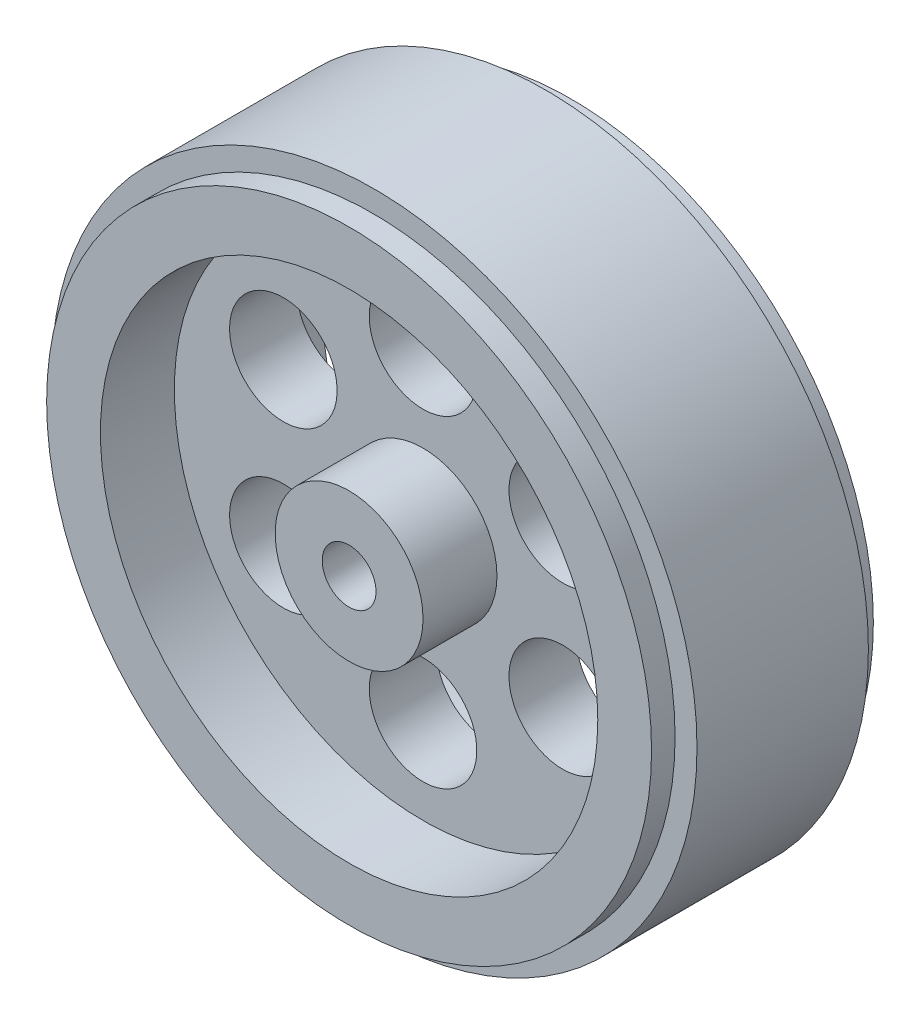
ISO-10303-21;
HEADER;
FILE_DESCRIPTION(('STEP AP214'),'2;1');
FILE_NAME('part.step','',(''),(''),'','','');
FILE_SCHEMA(('AUTOMOTIVE_DESIGN { 1 0 10303 214 1 1 1 1 }'));
ENDSEC;
DATA;
#1=APPLICATION_CONTEXT('core data for automotive mechanical design processes');
#2=APPLICATION_PROTOCOL_DEFINITION('international standard','automotive_design',2000,#1);
#3=PRODUCT_CONTEXT('',#1,'mechanical');
#4=PRODUCT('Part','Part','',(#3));
#5=PRODUCT_RELATED_PRODUCT_CATEGORY('part','',(#4));
#6=PRODUCT_DEFINITION_FORMATION('','',#4);
#7=PRODUCT_DEFINITION_CONTEXT('part definition',#1,'design');
#8=PRODUCT_DEFINITION('design','',#6,#7);
#9=PRODUCT_DEFINITION_SHAPE('','',#8);
#10=(LENGTH_UNIT() NAMED_UNIT(*) SI_UNIT(.MILLI.,.METRE.));
#11=(NAMED_UNIT(*) PLANE_ANGLE_UNIT() SI_UNIT($,.RADIAN.));
#12=(NAMED_UNIT(*) SI_UNIT($,.STERADIAN.) SOLID_ANGLE_UNIT());
#13=UNCERTAINTY_MEASURE_WITH_UNIT(LENGTH_MEASURE(1.E-05),#10,'distance_accuracy_value','');
#14=(GEOMETRIC_REPRESENTATION_CONTEXT(3) GLOBAL_UNCERTAINTY_ASSIGNED_CONTEXT((#13)) GLOBAL_UNIT_ASSIGNED_CONTEXT((#10,
#11,#12)) REPRESENTATION_CONTEXT('',''));
#15=CARTESIAN_POINT('',(0.,0.,0.));
#16=DIRECTION('',(0.,0.,1.));
#17=DIRECTION('',(1.,0.,0.));
#18=AXIS2_PLACEMENT_3D('',#15,#16,#17);
#19=CARTESIAN_POINT('',(0.,42.,13.));
#20=DIRECTION('',(0.,0.,1.));
#21=DIRECTION('',(1.,0.,0.));
#22=AXIS2_PLACEMENT_3D('',#19,#20,#21);
#23=PLANE('',#22);
#24=CARTESIAN_POINT('',(0.,0.,13.));
#25=DIRECTION('',(0.,0.,1.));
#26=DIRECTION('',(1.,0.,0.));
#27=AXIS2_PLACEMENT_3D('',#24,#25,#26);
#28=CIRCLE('',#27,45.);
#29=CARTESIAN_POINT('',(45.,0.,13.));
#30=VERTEX_POINT('',#29);
#31=EDGE_CURVE('E11',#30,#30,#28,.T.);
#32=ORIENTED_EDGE('',*,*,#31,.F.);
#33=EDGE_LOOP('',(#32));
#34=FACE_BOUND('',#33,.T.);
#35=CARTESIAN_POINT('',(0.,0.,13.));
#36=DIRECTION('',(0.,0.,1.));
#37=DIRECTION('',(1.,0.,0.));
#38=AXIS2_PLACEMENT_3D('',#35,#36,#37);
#39=CIRCLE('',#38,42.);
#40=CARTESIAN_POINT('',(42.,0.,13.));
#41=VERTEX_POINT('',#40);
#42=EDGE_CURVE('E87',#41,#41,#39,.T.);
#43=ORIENTED_EDGE('',*,*,#42,.T.);
#44=EDGE_LOOP('',(#43));
#45=FACE_BOUND('',#44,.T.);
#46=ADVANCED_FACE('F41',(#34,#45),#23,.F.);
#47=CARTESIAN_POINT('',(0.,0.,177.272954682522));
#48=DIRECTION('',(0.,0.,1.));
#49=DIRECTION('',(1.,0.,0.));
#50=AXIS2_PLACEMENT_3D('',#47,#48,#49);
#51=CYLINDRICAL_SURFACE('',#50,45.);
#52=CARTESIAN_POINT('',(0.,0.,16.5));
#53=DIRECTION('',(0.,0.,1.));
#54=DIRECTION('',(1.,0.,0.));
#55=AXIS2_PLACEMENT_3D('',#52,#53,#54);
#56=CIRCLE('',#55,45.);
#57=CARTESIAN_POINT('',(45.,0.,16.5));
#58=VERTEX_POINT('',#57);
#59=EDGE_CURVE('E47',#58,#58,#56,.T.);
#60=ORIENTED_EDGE('',*,*,#59,.F.);
#61=EDGE_LOOP('',(#60));
#62=FACE_BOUND('',#61,.T.);
#63=ORIENTED_EDGE('',*,*,#31,.T.);
#64=EDGE_LOOP('',(#63));
#65=FACE_BOUND('',#64,.T.);
#66=ADVANCED_FACE('F175',(#62,#65),#51,.T.);
#67=CARTESIAN_POINT('',(0.,45.,16.5));
#68=DIRECTION('',(0.,0.,-1.));
#69=DIRECTION('',(-1.,0.,0.));
#70=AXIS2_PLACEMENT_3D('',#67,#68,#69);
#71=PLANE('',#70);
#72=CARTESIAN_POINT('',(0.,0.,16.5));
#73=DIRECTION('',(0.,0.,1.));
#74=DIRECTION('',(1.,0.,0.));
#75=AXIS2_PLACEMENT_3D('',#72,#73,#74);
#76=CIRCLE('',#75,37.);
#77=CARTESIAN_POINT('',(37.,0.,16.5));
#78=VERTEX_POINT('',#77);
#79=EDGE_CURVE('E51',#78,#78,#76,.T.);
#80=ORIENTED_EDGE('',*,*,#79,.F.);
#81=EDGE_LOOP('',(#80));
#82=FACE_BOUND('',#81,.T.);
#83=ORIENTED_EDGE('',*,*,#59,.T.);
#84=EDGE_LOOP('',(#83));
#85=FACE_BOUND('',#84,.T.);
#86=ADVANCED_FACE('F170',(#82,#85),#71,.F.);
#87=CARTESIAN_POINT('',(0.,0.,177.272954682522));
#88=DIRECTION('',(0.,0.,1.));
#89=DIRECTION('',(1.,0.,0.));
#90=AXIS2_PLACEMENT_3D('',#87,#88,#89);
#91=CYLINDRICAL_SURFACE('',#90,37.);
#92=CARTESIAN_POINT('',(0.,0.,5.50000000000001));
#93=DIRECTION('',(0.,0.,1.));
#94=DIRECTION('',(1.,0.,0.));
#95=AXIS2_PLACEMENT_3D('',#92,#93,#94);
#96=CIRCLE('',#95,37.);
#97=CARTESIAN_POINT('',(37.,0.,5.50000000000001));
#98=VERTEX_POINT('',#97);
#99=EDGE_CURVE('E55',#98,#98,#96,.T.);
#100=ORIENTED_EDGE('',*,*,#99,.F.);
#101=EDGE_LOOP('',(#100));
#102=FACE_BOUND('',#101,.T.);
#103=ORIENTED_EDGE('',*,*,#79,.T.);
#104=EDGE_LOOP('',(#103));
#105=FACE_BOUND('',#104,.T.);
#106=ADVANCED_FACE('F163',(#102,#105),#91,.F.);
#107=CARTESIAN_POINT('',(0.,11.,5.5));
#108=DIRECTION('',(0.,0.,-1.));
#109=DIRECTION('',(-1.,0.,0.));
#110=AXIS2_PLACEMENT_3D('',#107,#108,#109);
#111=PLANE('',#110);
#112=CARTESIAN_POINT('',(-20.7846096908273,12.0000000000012,5.49999999999999));
#113=DIRECTION('',(0.,0.,-1.));
#114=DIRECTION('',(-1.,0.,0.));
#115=AXIS2_PLACEMENT_3D('',#112,#113,#114);
#116=CIRCLE('',#115,8.);
#117=CARTESIAN_POINT('',(-28.7846096908273,12.0000000000012,5.49999999999999));
#118=VERTEX_POINT('',#117);
#119=EDGE_CURVE('E90',#118,#118,#116,.T.);
#120=ORIENTED_EDGE('',*,*,#119,.T.);
#121=EDGE_LOOP('',(#120));
#122=FACE_BOUND('',#121,.T.);
#123=CARTESIAN_POINT('',(-20.7846096908286,-11.9999999999988,5.49999999999999));
#124=DIRECTION('',(0.,0.,-1.));
#125=DIRECTION('',(-1.,0.,0.));
#126=AXIS2_PLACEMENT_3D('',#123,#124,#125);
#127=CIRCLE('',#126,8.);
#128=CARTESIAN_POINT('',(-28.7846096908286,-11.9999999999988,5.49999999999999));
#129=VERTEX_POINT('',#128);
#130=EDGE_CURVE('E93',#129,#129,#127,.T.);
#131=ORIENTED_EDGE('',*,*,#130,.T.);
#132=EDGE_LOOP('',(#131));
#133=FACE_BOUND('',#132,.T.);
#134=CARTESIAN_POINT('',(-2.77926552252381E-12,-24.,5.49999999999999));
#135=DIRECTION('',(0.,0.,-1.));
#136=DIRECTION('',(-1.,0.,0.));
#137=AXIS2_PLACEMENT_3D('',#134,#135,#136);
#138=CIRCLE('',#137,8.);
#139=CARTESIAN_POINT('',(-8.00000000000278,-24.,5.49999999999999));
#140=VERTEX_POINT('',#139);
#141=EDGE_CURVE('E96',#140,#140,#138,.T.);
#142=ORIENTED_EDGE('',*,*,#141,.T.);
#143=EDGE_LOOP('',(#142));
#144=FACE_BOUND('',#143,.T.);
#145=CARTESIAN_POINT('',(20.7846096908244,-12.0000000000012,5.49999999999999));
#146=DIRECTION('',(0.,0.,-1.));
#147=DIRECTION('',(-1.,0.,0.));
#148=AXIS2_PLACEMENT_3D('',#145,#146,#147);
#149=CIRCLE('',#148,8.);
#150=CARTESIAN_POINT('',(12.7846096908244,-12.0000000000012,5.49999999999999));
#151=VERTEX_POINT('',#150);
#152=EDGE_CURVE('E99',#151,#151,#149,.T.);
#153=ORIENTED_EDGE('',*,*,#152,.T.);
#154=EDGE_LOOP('',(#153));
#155=FACE_BOUND('',#154,.T.);
#156=CARTESIAN_POINT('',(20.7846096908258,11.9999999999988,5.49999999999999));
#157=DIRECTION('',(0.,0.,-1.));
#158=DIRECTION('',(-1.,0.,0.));
#159=AXIS2_PLACEMENT_3D('',#156,#157,#158);
#160=CIRCLE('',#159,8.);
#161=CARTESIAN_POINT('',(12.7846096908258,11.9999999999988,5.49999999999999));
#162=VERTEX_POINT('',#161);
#163=EDGE_CURVE('E102',#162,#162,#160,.T.);
#164=ORIENTED_EDGE('',*,*,#163,.T.);
#165=EDGE_LOOP('',(#164));
#166=FACE_BOUND('',#165,.T.);
#167=CARTESIAN_POINT('',(0.,24.,5.49999999999999));
#168=DIRECTION('',(0.,0.,-1.));
#169=DIRECTION('',(-1.,0.,0.));
#170=AXIS2_PLACEMENT_3D('',#167,#168,#169);
#171=CIRCLE('',#170,8.);
#172=CARTESIAN_POINT('',(-8.00000000000006,24.,5.49999999999999));
#173=VERTEX_POINT('',#172);
#174=EDGE_CURVE('E105',#173,#173,#171,.T.);
#175=ORIENTED_EDGE('',*,*,#174,.T.);
#176=EDGE_LOOP('',(#175));
#177=FACE_BOUND('',#176,.T.);
#178=CARTESIAN_POINT('',(0.,0.,5.50000000000001));
#179=DIRECTION('',(0.,0.,1.));
#180=DIRECTION('',(1.,0.,0.));
#181=AXIS2_PLACEMENT_3D('',#178,#179,#180);
#182=CIRCLE('',#181,11.);
#183=CARTESIAN_POINT('',(11.,0.,5.50000000000001));
#184=VERTEX_POINT('',#183);
#185=EDGE_CURVE('E60',#184,#184,#182,.T.);
#186=ORIENTED_EDGE('',*,*,#185,.F.);
#187=EDGE_LOOP('',(#186));
#188=FACE_BOUND('',#187,.T.);
#189=ORIENTED_EDGE('',*,*,#99,.T.);
#190=EDGE_LOOP('',(#189));
#191=FACE_BOUND('',#190,.T.);
#192=ADVANCED_FACE('F157',(#122,#133,#144,#155,#166,#177,#188,#191),#111,.F.);
#193=CARTESIAN_POINT('',(0.,0.,177.272954682522));
#194=DIRECTION('',(0.,0.,1.));
#195=DIRECTION('',(1.,0.,0.));
#196=AXIS2_PLACEMENT_3D('',#193,#194,#195);
#197=CYLINDRICAL_SURFACE('',#196,11.);
#198=CARTESIAN_POINT('',(0.,0.,16.5));
#199=DIRECTION('',(0.,0.,1.));
#200=DIRECTION('',(1.,0.,0.));
#201=AXIS2_PLACEMENT_3D('',#198,#199,#200);
#202=CIRCLE('',#201,11.);
#203=CARTESIAN_POINT('',(11.,0.,16.5));
#204=VERTEX_POINT('',#203);
#205=EDGE_CURVE('E63',#204,#204,#202,.T.);
#206=ORIENTED_EDGE('',*,*,#205,.F.);
#207=EDGE_LOOP('',(#206));
#208=FACE_BOUND('',#207,.T.);
#209=ORIENTED_EDGE('',*,*,#185,.T.);
#210=EDGE_LOOP('',(#209));
#211=FACE_BOUND('',#210,.T.);
#212=ADVANCED_FACE('F151',(#208,#211),#197,.T.);
#213=CARTESIAN_POINT('',(0.,4.,16.5));
#214=DIRECTION('',(0.,0.,-1.));
#215=DIRECTION('',(-1.,0.,0.));
#216=AXIS2_PLACEMENT_3D('',#213,#214,#215);
#217=PLANE('',#216);
#218=CARTESIAN_POINT('',(0.,0.,16.5));
#219=DIRECTION('',(0.,0.,1.));
#220=DIRECTION('',(1.,0.,0.));
#221=AXIS2_PLACEMENT_3D('',#218,#219,#220);
#222=CIRCLE('',#221,4.);
#223=CARTESIAN_POINT('',(4.,0.,16.5));
#224=VERTEX_POINT('',#223);
#225=EDGE_CURVE('E66',#224,#224,#222,.T.);
#226=ORIENTED_EDGE('',*,*,#225,.F.);
#227=EDGE_LOOP('',(#226));
#228=FACE_BOUND('',#227,.T.);
#229=ORIENTED_EDGE('',*,*,#205,.T.);
#230=EDGE_LOOP('',(#229));
#231=FACE_BOUND('',#230,.T.);
#232=ADVANCED_FACE('F145',(#228,#231),#217,.F.);
#233=CARTESIAN_POINT('',(0.,0.,177.272954682522));
#234=DIRECTION('',(0.,0.,1.));
#235=DIRECTION('',(1.,0.,0.));
#236=AXIS2_PLACEMENT_3D('',#233,#234,#235);
#237=CYLINDRICAL_SURFACE('',#236,4.);
#238=CARTESIAN_POINT('',(0.,0.,-4.5));
#239=DIRECTION('',(0.,0.,1.));
#240=DIRECTION('',(1.,0.,0.));
#241=AXIS2_PLACEMENT_3D('',#238,#239,#240);
#242=CIRCLE('',#241,4.);
#243=CARTESIAN_POINT('',(4.,0.,-4.5));
#244=VERTEX_POINT('',#243);
#245=EDGE_CURVE('E69',#244,#244,#242,.T.);
#246=ORIENTED_EDGE('',*,*,#245,.F.);
#247=EDGE_LOOP('',(#246));
#248=FACE_BOUND('',#247,.T.);
#249=ORIENTED_EDGE('',*,*,#225,.T.);
#250=EDGE_LOOP('',(#249));
#251=FACE_BOUND('',#250,.T.);
#252=ADVANCED_FACE('F134',(#248,#251),#237,.F.);
#253=CARTESIAN_POINT('',(0.,37.,-4.5));
#254=DIRECTION('',(0.,0.,1.));
#255=DIRECTION('',(1.,0.,0.));
#256=AXIS2_PLACEMENT_3D('',#253,#254,#255);
#257=PLANE('',#256);
#258=CARTESIAN_POINT('',(-20.7846096908273,12.0000000000012,-4.5));
#259=DIRECTION('',(0.,0.,-1.));
#260=DIRECTION('',(-1.,0.,0.));
#261=AXIS2_PLACEMENT_3D('',#258,#259,#260);
#262=CIRCLE('',#261,8.);
#263=CARTESIAN_POINT('',(-28.7846096908273,12.0000000000012,-4.5));
#264=VERTEX_POINT('',#263);
#265=EDGE_CURVE('E111',#264,#264,#262,.T.);
#266=ORIENTED_EDGE('',*,*,#265,.F.);
#267=EDGE_LOOP('',(#266));
#268=FACE_BOUND('',#267,.T.);
#269=CARTESIAN_POINT('',(-20.7846096908286,-11.9999999999988,-4.5));
#270=DIRECTION('',(0.,0.,-1.));
#271=DIRECTION('',(-1.,0.,0.));
#272=AXIS2_PLACEMENT_3D('',#269,#270,#271);
#273=CIRCLE('',#272,8.);
#274=CARTESIAN_POINT('',(-28.7846096908286,-11.9999999999988,-4.5));
#275=VERTEX_POINT('',#274);
#276=EDGE_CURVE('E119',#275,#275,#273,.T.);
#277=ORIENTED_EDGE('',*,*,#276,.F.);
#278=EDGE_LOOP('',(#277));
#279=FACE_BOUND('',#278,.T.);
#280=CARTESIAN_POINT('',(-2.77926552252381E-12,-24.,-4.5));
#281=DIRECTION('',(0.,0.,-1.));
#282=DIRECTION('',(-1.,0.,0.));
#283=AXIS2_PLACEMENT_3D('',#280,#281,#282);
#284=CIRCLE('',#283,8.);
#285=CARTESIAN_POINT('',(-8.00000000000278,-24.,-4.5));
#286=VERTEX_POINT('',#285);
#287=EDGE_CURVE('E115',#286,#286,#284,.T.);
#288=ORIENTED_EDGE('',*,*,#287,.F.);
#289=EDGE_LOOP('',(#288));
#290=FACE_BOUND('',#289,.T.);
#291=CARTESIAN_POINT('',(20.7846096908244,-12.0000000000012,-4.5));
#292=DIRECTION('',(0.,0.,-1.));
#293=DIRECTION('',(-1.,0.,0.));
#294=AXIS2_PLACEMENT_3D('',#291,#292,#293);
#295=CIRCLE('',#294,8.);
#296=CARTESIAN_POINT('',(12.7846096908244,-12.0000000000012,-4.5));
#297=VERTEX_POINT('',#296);
#298=EDGE_CURVE('E112',#297,#297,#295,.T.);
#299=ORIENTED_EDGE('',*,*,#298,.F.);
#300=EDGE_LOOP('',(#299));
#301=FACE_BOUND('',#300,.T.);
#302=CARTESIAN_POINT('',(20.7846096908258,11.9999999999988,-4.5));
#303=DIRECTION('',(0.,0.,-1.));
#304=DIRECTION('',(-1.,0.,0.));
#305=AXIS2_PLACEMENT_3D('',#302,#303,#304);
#306=CIRCLE('',#305,8.);
#307=CARTESIAN_POINT('',(12.7846096908258,11.9999999999988,-4.5));
#308=VERTEX_POINT('',#307);
#309=EDGE_CURVE('E116',#308,#308,#306,.T.);
#310=ORIENTED_EDGE('',*,*,#309,.F.);
#311=EDGE_LOOP('',(#310));
#312=FACE_BOUND('',#311,.T.);
#313=CARTESIAN_POINT('',(0.,24.,-4.5));
#314=DIRECTION('',(0.,0.,-1.));
#315=DIRECTION('',(-1.,0.,0.));
#316=AXIS2_PLACEMENT_3D('',#313,#314,#315);
#317=CIRCLE('',#316,8.);
#318=CARTESIAN_POINT('',(-8.00000000000006,24.,-4.5));
#319=VERTEX_POINT('',#318);
#320=EDGE_CURVE('E108',#319,#319,#317,.T.);
#321=ORIENTED_EDGE('',*,*,#320,.F.);
#322=EDGE_LOOP('',(#321));
#323=FACE_BOUND('',#322,.T.);
#324=CARTESIAN_POINT('',(0.,0.,-4.5));
#325=DIRECTION('',(0.,0.,1.));
#326=DIRECTION('',(1.,0.,0.));
#327=AXIS2_PLACEMENT_3D('',#324,#325,#326);
#328=CIRCLE('',#327,37.);
#329=CARTESIAN_POINT('',(37.,0.,-4.5));
#330=VERTEX_POINT('',#329);
#331=EDGE_CURVE('E72',#330,#330,#328,.T.);
#332=ORIENTED_EDGE('',*,*,#331,.F.);
#333=EDGE_LOOP('',(#332));
#334=FACE_BOUND('',#333,.T.);
#335=ORIENTED_EDGE('',*,*,#245,.T.);
#336=EDGE_LOOP('',(#335));
#337=FACE_BOUND('',#336,.T.);
#338=ADVANCED_FACE('F130',(#268,#279,#290,#301,#312,#323,#334,#337),#257,.F.);
#339=CARTESIAN_POINT('',(0.,0.,177.272954682522));
#340=DIRECTION('',(0.,0.,1.));
#341=DIRECTION('',(1.,0.,0.));
#342=AXIS2_PLACEMENT_3D('',#339,#340,#341);
#343=CYLINDRICAL_SURFACE('',#342,37.);
#344=CARTESIAN_POINT('',(0.,0.,-16.5));
#345=DIRECTION('',(0.,0.,1.));
#346=DIRECTION('',(1.,0.,0.));
#347=AXIS2_PLACEMENT_3D('',#344,#345,#346);
#348=CIRCLE('',#347,37.);
#349=CARTESIAN_POINT('',(37.,0.,-16.5));
#350=VERTEX_POINT('',#349);
#351=EDGE_CURVE('E75',#350,#350,#348,.T.);
#352=ORIENTED_EDGE('',*,*,#351,.F.);
#353=EDGE_LOOP('',(#352));
#354=FACE_BOUND('',#353,.T.);
#355=ORIENTED_EDGE('',*,*,#331,.T.);
#356=EDGE_LOOP('',(#355));
#357=FACE_BOUND('',#356,.T.);
#358=ADVANCED_FACE('F133',(#354,#357),#343,.F.);
#359=CARTESIAN_POINT('',(0.,45.,-16.5));
#360=DIRECTION('',(0.,0.,1.));
#361=DIRECTION('',(1.,0.,0.));
#362=AXIS2_PLACEMENT_3D('',#359,#360,#361);
#363=PLANE('',#362);
#364=CARTESIAN_POINT('',(0.,0.,-16.5));
#365=DIRECTION('',(0.,0.,1.));
#366=DIRECTION('',(1.,0.,0.));
#367=AXIS2_PLACEMENT_3D('',#364,#365,#366);
#368=CIRCLE('',#367,45.);
#369=CARTESIAN_POINT('',(45.,0.,-16.5));
#370=VERTEX_POINT('',#369);
#371=EDGE_CURVE('E78',#370,#370,#368,.T.);
#372=ORIENTED_EDGE('',*,*,#371,.F.);
#373=EDGE_LOOP('',(#372));
#374=FACE_BOUND('',#373,.T.);
#375=ORIENTED_EDGE('',*,*,#351,.T.);
#376=EDGE_LOOP('',(#375));
#377=FACE_BOUND('',#376,.T.);
#378=ADVANCED_FACE('F204',(#374,#377),#363,.F.);
#379=CARTESIAN_POINT('',(0.,0.,177.272954682522));
#380=DIRECTION('',(0.,0.,1.));
#381=DIRECTION('',(1.,0.,0.));
#382=AXIS2_PLACEMENT_3D('',#379,#380,#381);
#383=CYLINDRICAL_SURFACE('',#382,45.);
#384=CARTESIAN_POINT('',(0.,0.,-13.));
#385=DIRECTION('',(0.,0.,1.));
#386=DIRECTION('',(1.,0.,0.));
#387=AXIS2_PLACEMENT_3D('',#384,#385,#386);
#388=CIRCLE('',#387,45.);
#389=CARTESIAN_POINT('',(45.,0.,-13.));
#390=VERTEX_POINT('',#389);
#391=EDGE_CURVE('E81',#390,#390,#388,.T.);
#392=ORIENTED_EDGE('',*,*,#391,.F.);
#393=EDGE_LOOP('',(#392));
#394=FACE_BOUND('',#393,.T.);
#395=ORIENTED_EDGE('',*,*,#371,.T.);
#396=EDGE_LOOP('',(#395));
#397=FACE_BOUND('',#396,.T.);
#398=ADVANCED_FACE('F198',(#394,#397),#383,.T.);
#399=CARTESIAN_POINT('',(0.,42.,-13.));
#400=DIRECTION('',(0.,0.,-1.));
#401=DIRECTION('',(-1.,0.,0.));
#402=AXIS2_PLACEMENT_3D('',#399,#400,#401);
#403=PLANE('',#402);
#404=CARTESIAN_POINT('',(0.,0.,-13.));
#405=DIRECTION('',(0.,0.,1.));
#406=DIRECTION('',(1.,0.,0.));
#407=AXIS2_PLACEMENT_3D('',#404,#405,#406);
#408=CIRCLE('',#407,42.);
#409=CARTESIAN_POINT('',(42.,0.,-13.));
#410=VERTEX_POINT('',#409);
#411=EDGE_CURVE('E84',#410,#410,#408,.T.);
#412=ORIENTED_EDGE('',*,*,#411,.F.);
#413=EDGE_LOOP('',(#412));
#414=FACE_BOUND('',#413,.T.);
#415=ORIENTED_EDGE('',*,*,#391,.T.);
#416=EDGE_LOOP('',(#415));
#417=FACE_BOUND('',#416,.T.);
#418=ADVANCED_FACE('F192',(#414,#417),#403,.F.);
#419=CARTESIAN_POINT('',(0.,0.,177.272954682522));
#420=DIRECTION('',(0.,0.,1.));
#421=DIRECTION('',(1.,0.,0.));
#422=AXIS2_PLACEMENT_3D('',#419,#420,#421);
#423=CYLINDRICAL_SURFACE('',#422,42.);
#424=ORIENTED_EDGE('',*,*,#42,.F.);
#425=EDGE_LOOP('',(#424));
#426=FACE_BOUND('',#425,.T.);
#427=ORIENTED_EDGE('',*,*,#411,.T.);
#428=EDGE_LOOP('',(#427));
#429=FACE_BOUND('',#428,.T.);
#430=ADVANCED_FACE('F188',(#426,#429),#423,.T.);
#431=CARTESIAN_POINT('',(0.,24.,16.5));
#432=DIRECTION('',(0.,0.,-1.));
#433=DIRECTION('',(-1.,0.,0.));
#434=AXIS2_PLACEMENT_3D('',#431,#432,#433);
#435=CYLINDRICAL_SURFACE('',#434,8.);
#436=ORIENTED_EDGE('',*,*,#320,.T.);
#437=EDGE_LOOP('',(#436));
#438=FACE_BOUND('',#437,.T.);
#439=ORIENTED_EDGE('',*,*,#174,.F.);
#440=EDGE_LOOP('',(#439));
#441=FACE_BOUND('',#440,.T.);
#442=ADVANCED_FACE('F191',(#438,#441),#435,.F.);
#443=CARTESIAN_POINT('',(20.7846096908258,11.9999999999988,16.5));
#444=DIRECTION('',(0.,0.,-1.));
#445=DIRECTION('',(-1.,0.,0.));
#446=AXIS2_PLACEMENT_3D('',#443,#444,#445);
#447=CYLINDRICAL_SURFACE('',#446,8.);
#448=ORIENTED_EDGE('',*,*,#309,.T.);
#449=EDGE_LOOP('',(#448));
#450=FACE_BOUND('',#449,.T.);
#451=ORIENTED_EDGE('',*,*,#163,.F.);
#452=EDGE_LOOP('',(#451));
#453=FACE_BOUND('',#452,.T.);
#454=ADVANCED_FACE('F127',(#450,#453),#447,.F.);
#455=CARTESIAN_POINT('',(20.7846096908244,-12.0000000000012,16.5));
#456=DIRECTION('',(0.,0.,-1.));
#457=DIRECTION('',(-1.,0.,0.));
#458=AXIS2_PLACEMENT_3D('',#455,#456,#457);
#459=CYLINDRICAL_SURFACE('',#458,8.);
#460=ORIENTED_EDGE('',*,*,#298,.T.);
#461=EDGE_LOOP('',(#460));
#462=FACE_BOUND('',#461,.T.);
#463=ORIENTED_EDGE('',*,*,#152,.F.);
#464=EDGE_LOOP('',(#463));
#465=FACE_BOUND('',#464,.T.);
#466=ADVANCED_FACE('F222',(#462,#465),#459,.F.);
#467=CARTESIAN_POINT('',(-2.77926552252381E-12,-24.,16.5));
#468=DIRECTION('',(0.,0.,-1.));
#469=DIRECTION('',(-1.,0.,0.));
#470=AXIS2_PLACEMENT_3D('',#467,#468,#469);
#471=CYLINDRICAL_SURFACE('',#470,8.);
#472=ORIENTED_EDGE('',*,*,#287,.T.);
#473=EDGE_LOOP('',(#472));
#474=FACE_BOUND('',#473,.T.);
#475=ORIENTED_EDGE('',*,*,#141,.F.);
#476=EDGE_LOOP('',(#475));
#477=FACE_BOUND('',#476,.T.);
#478=ADVANCED_FACE('F225',(#474,#477),#471,.F.);
#479=CARTESIAN_POINT('',(-20.7846096908286,-11.9999999999988,16.5));
#480=DIRECTION('',(0.,0.,-1.));
#481=DIRECTION('',(-1.,0.,0.));
#482=AXIS2_PLACEMENT_3D('',#479,#480,#481);
#483=CYLINDRICAL_SURFACE('',#482,8.);
#484=ORIENTED_EDGE('',*,*,#276,.T.);
#485=EDGE_LOOP('',(#484));
#486=FACE_BOUND('',#485,.T.);
#487=ORIENTED_EDGE('',*,*,#130,.F.);
#488=EDGE_LOOP('',(#487));
#489=FACE_BOUND('',#488,.T.);
#490=ADVANCED_FACE('F229',(#486,#489),#483,.F.);
#491=CARTESIAN_POINT('',(-20.7846096908273,12.0000000000012,16.5));
#492=DIRECTION('',(0.,0.,-1.));
#493=DIRECTION('',(-1.,0.,0.));
#494=AXIS2_PLACEMENT_3D('',#491,#492,#493);
#495=CYLINDRICAL_SURFACE('',#494,8.);
#496=ORIENTED_EDGE('',*,*,#265,.T.);
#497=EDGE_LOOP('',(#496));
#498=FACE_BOUND('',#497,.T.);
#499=ORIENTED_EDGE('',*,*,#119,.F.);
#500=EDGE_LOOP('',(#499));
#501=FACE_BOUND('',#500,.T.);
#502=ADVANCED_FACE('F233',(#498,#501),#495,.F.);
#503=CLOSED_SHELL('',(#46,#66,#86,#106,#192,#212,#232,#252,#338,#358,#378,#398,#418,#430,#442,
#454,#466,#478,#490,#502));
#504=MANIFOLD_SOLID_BREP('B2',#503);
#505=CARTESIAN_POINT('',(0.,0.,177.272954682522));
#506=DIRECTION('',(0.,0.,1.));
#507=DIRECTION('',(1.,0.,0.));
#508=AXIS2_PLACEMENT_3D('',#505,#506,#507);
#509=CYLINDRICAL_SURFACE('',#508,42.01);
#510=CARTESIAN_POINT('',(0.,0.,-12.75));
#511=DIRECTION('',(0.,0.,1.));
#512=DIRECTION('',(1.,0.,0.));
#513=AXIS2_PLACEMENT_3D('',#510,#511,#512);
#514=CIRCLE('',#513,42.01);
#515=CARTESIAN_POINT('',(42.01,0.,-12.75));
#516=VERTEX_POINT('',#515);
#517=EDGE_CURVE('E393',#516,#516,#514,.T.);
#518=ORIENTED_EDGE('',*,*,#517,.F.);
#519=EDGE_LOOP('',(#518));
#520=FACE_BOUND('',#519,.T.);
#521=CARTESIAN_POINT('',(0.,0.,12.75));
#522=DIRECTION('',(0.,0.,1.));
#523=DIRECTION('',(1.,0.,0.));
#524=AXIS2_PLACEMENT_3D('',#521,#522,#523);
#525=CIRCLE('',#524,42.01);
#526=CARTESIAN_POINT('',(42.01,0.,12.75));
#527=VERTEX_POINT('',#526);
#528=EDGE_CURVE('E40',#527,#527,#525,.T.);
#529=ORIENTED_EDGE('',*,*,#528,.T.);
#530=EDGE_LOOP('',(#529));
#531=FACE_BOUND('',#530,.T.);
#532=ADVANCED_FACE('F379',(#520,#531),#509,.F.);
#533=CARTESIAN_POINT('',(0.,42.01,12.75));
#534=DIRECTION('',(0.,0.,-1.));
#535=DIRECTION('',(-1.,0.,0.));
#536=AXIS2_PLACEMENT_3D('',#533,#534,#535);
#537=PLANE('',#536);
#538=ORIENTED_EDGE('',*,*,#528,.F.);
#539=EDGE_LOOP('',(#538));
#540=FACE_BOUND('',#539,.T.);
#541=CARTESIAN_POINT('',(0.,0.,12.75));
#542=DIRECTION('',(0.,0.,1.));
#543=DIRECTION('',(1.,0.,0.));
#544=AXIS2_PLACEMENT_3D('',#541,#542,#543);
#545=CIRCLE('',#544,48.01);
#546=CARTESIAN_POINT('',(48.01,0.,12.75));
#547=VERTEX_POINT('',#546);
#548=EDGE_CURVE('E385',#547,#547,#545,.T.);
#549=ORIENTED_EDGE('',*,*,#548,.T.);
#550=EDGE_LOOP('',(#549));
#551=FACE_BOUND('',#550,.T.);
#552=ADVANCED_FACE('F402',(#540,#551),#537,.F.);
#553=CARTESIAN_POINT('',(0.,0.,177.272954682522));
#554=DIRECTION('',(0.,0.,1.));
#555=DIRECTION('',(1.,0.,0.));
#556=AXIS2_PLACEMENT_3D('',#553,#554,#555);
#557=CYLINDRICAL_SURFACE('',#556,48.01);
#558=ORIENTED_EDGE('',*,*,#548,.F.);
#559=EDGE_LOOP('',(#558));
#560=FACE_BOUND('',#559,.T.);
#561=CARTESIAN_POINT('',(0.,0.,-12.75));
#562=DIRECTION('',(0.,0.,1.));
#563=DIRECTION('',(1.,0.,0.));
#564=AXIS2_PLACEMENT_3D('',#561,#562,#563);
#565=CIRCLE('',#564,48.01);
#566=CARTESIAN_POINT('',(48.01,0.,-12.75));
#567=VERTEX_POINT('',#566);
#568=EDGE_CURVE('E389',#567,#567,#565,.T.);
#569=ORIENTED_EDGE('',*,*,#568,.T.);
#570=EDGE_LOOP('',(#569));
#571=FACE_BOUND('',#570,.T.);
#572=ADVANCED_FACE('F406',(#560,#571),#557,.T.);
#573=CARTESIAN_POINT('',(0.,42.01,-12.75));
#574=DIRECTION('',(0.,0.,1.));
#575=DIRECTION('',(1.,0.,0.));
#576=AXIS2_PLACEMENT_3D('',#573,#574,#575);
#577=PLANE('',#576);
#578=ORIENTED_EDGE('',*,*,#568,.F.);
#579=EDGE_LOOP('',(#578));
#580=FACE_BOUND('',#579,.T.);
#581=ORIENTED_EDGE('',*,*,#517,.T.);
#582=EDGE_LOOP('',(#581));
#583=FACE_BOUND('',#582,.T.);
#584=ADVANCED_FACE('F399',(#580,#583),#577,.F.);
#585=CLOSED_SHELL('',(#532,#552,#572,#584));
#586=MANIFOLD_SOLID_BREP('B6',#585);
#587=ADVANCED_BREP_SHAPE_REPRESENTATION('',(#18,#504,#586),#14);
#588=SHAPE_DEFINITION_REPRESENTATION(#9,#587);
ENDSEC;
END-ISO-10303-21;
